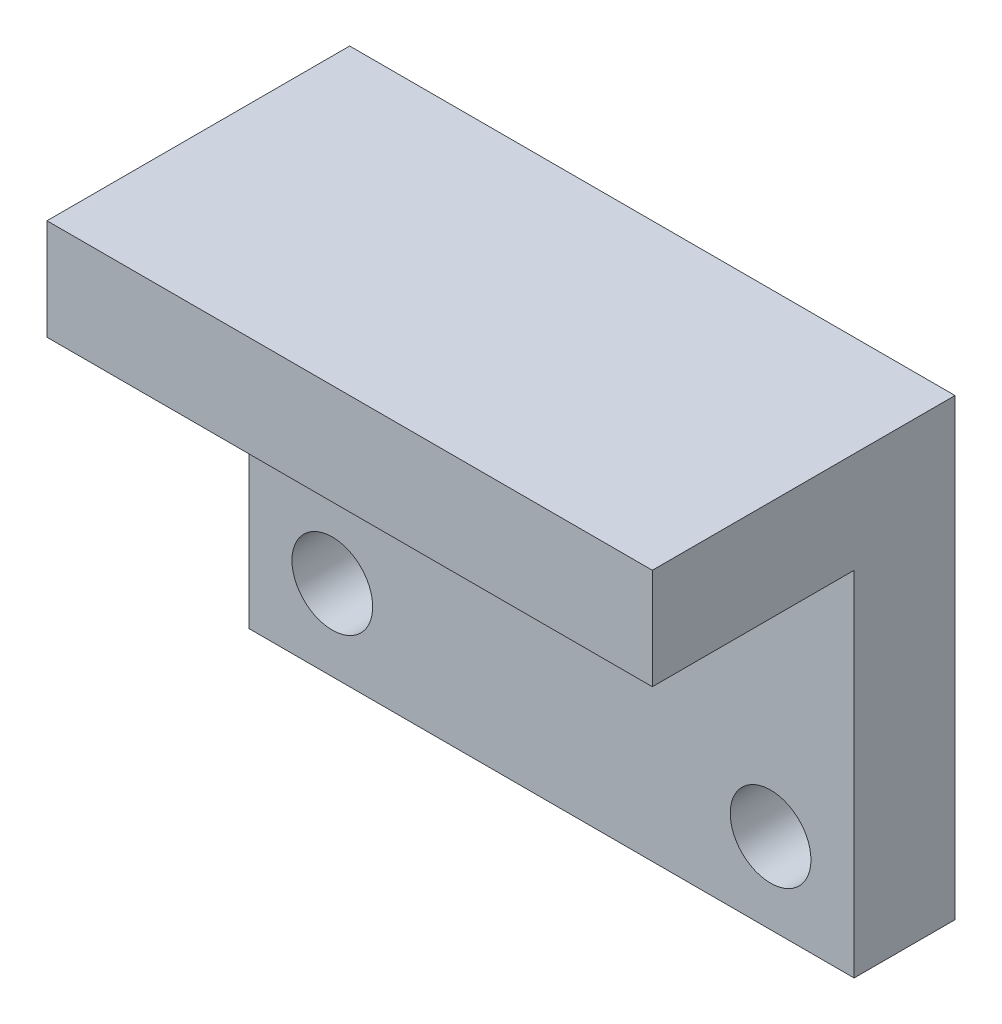
ISO-10303-21;
HEADER;
FILE_DESCRIPTION(('STEP AP214'),'2;1');
FILE_NAME('part.step','',(''),(''),'','','');
FILE_SCHEMA(('AUTOMOTIVE_DESIGN { 1 0 10303 214 1 1 1 1 }'));
ENDSEC;
DATA;
#1=APPLICATION_CONTEXT('core data for automotive mechanical design processes');
#2=APPLICATION_PROTOCOL_DEFINITION('international standard','automotive_design',2000,#1);
#3=PRODUCT_CONTEXT('',#1,'mechanical');
#4=PRODUCT('Part','Part','',(#3));
#5=PRODUCT_RELATED_PRODUCT_CATEGORY('part','',(#4));
#6=PRODUCT_DEFINITION_FORMATION('','',#4);
#7=PRODUCT_DEFINITION_CONTEXT('part definition',#1,'design');
#8=PRODUCT_DEFINITION('design','',#6,#7);
#9=PRODUCT_DEFINITION_SHAPE('','',#8);
#10=(LENGTH_UNIT() NAMED_UNIT(*) SI_UNIT(.MILLI.,.METRE.));
#11=(NAMED_UNIT(*) PLANE_ANGLE_UNIT() SI_UNIT($,.RADIAN.));
#12=(NAMED_UNIT(*) SI_UNIT($,.STERADIAN.) SOLID_ANGLE_UNIT());
#13=UNCERTAINTY_MEASURE_WITH_UNIT(LENGTH_MEASURE(1.E-05),#10,'distance_accuracy_value','');
#14=(GEOMETRIC_REPRESENTATION_CONTEXT(3) GLOBAL_UNCERTAINTY_ASSIGNED_CONTEXT((#13)) GLOBAL_UNIT_ASSIGNED_CONTEXT((#10,
#11,#12)) REPRESENTATION_CONTEXT('',''));
#15=CARTESIAN_POINT('',(0.,0.,0.));
#16=DIRECTION('',(0.,0.,1.));
#17=DIRECTION('',(1.,0.,0.));
#18=AXIS2_PLACEMENT_3D('',#15,#16,#17);
#19=CARTESIAN_POINT('',(0.,0.,5.));
#20=DIRECTION('',(0.,0.,1.));
#21=DIRECTION('',(1.,0.,0.));
#22=AXIS2_PLACEMENT_3D('',#19,#20,#21);
#23=PLANE('',#22);
#24=CARTESIAN_POINT('',(10.86,-3.5,5.));
#25=DIRECTION('',(0.,0.,1.));
#26=DIRECTION('',(1.,0.,0.));
#27=AXIS2_PLACEMENT_3D('',#24,#25,#26);
#28=CIRCLE('',#27,2.);
#29=CARTESIAN_POINT('',(12.86,-3.5,5.));
#30=VERTEX_POINT('',#29);
#31=EDGE_CURVE('E115',#30,#30,#28,.T.);
#32=ORIENTED_EDGE('',*,*,#31,.F.);
#33=EDGE_LOOP('',(#32));
#34=FACE_BOUND('',#33,.T.);
#35=DIRECTION('',(0.,1.,0.));
#36=VECTOR('',#35,1.);
#37=CARTESIAN_POINT('',(15.,10.,5.));
#38=LINE('',#37,#36);
#39=CARTESIAN_POINT('',(15.,-7.5,5.));
#40=VERTEX_POINT('',#39);
#41=CARTESIAN_POINT('',(15.,10.,5.));
#42=VERTEX_POINT('',#41);
#43=EDGE_CURVE('E101',#40,#42,#38,.T.);
#44=ORIENTED_EDGE('',*,*,#43,.T.);
#45=DIRECTION('',(-1.,0.,0.));
#46=VECTOR('',#45,1.);
#47=CARTESIAN_POINT('',(-15.,10.,5.));
#48=LINE('',#47,#46);
#49=CARTESIAN_POINT('',(-15.,10.,5.));
#50=VERTEX_POINT('',#49);
#51=EDGE_CURVE('E78',#42,#50,#48,.T.);
#52=ORIENTED_EDGE('',*,*,#51,.T.);
#53=DIRECTION('',(0.,-1.,0.));
#54=VECTOR('',#53,1.);
#55=CARTESIAN_POINT('',(-15.,10.,5.));
#56=LINE('',#55,#54);
#57=CARTESIAN_POINT('',(-15.,-7.5,5.));
#58=VERTEX_POINT('',#57);
#59=EDGE_CURVE('E99',#50,#58,#56,.T.);
#60=ORIENTED_EDGE('',*,*,#59,.T.);
#61=DIRECTION('',(1.,0.,0.));
#62=VECTOR('',#61,1.);
#63=CARTESIAN_POINT('',(-15.,-7.5,5.));
#64=LINE('',#63,#62);
#65=EDGE_CURVE('E57',#58,#40,#64,.T.);
#66=ORIENTED_EDGE('',*,*,#65,.T.);
#67=EDGE_LOOP('',(#44,#52,#60,#66));
#68=FACE_BOUND('',#67,.T.);
#69=CARTESIAN_POINT('',(-10.86,-3.5,5.));
#70=DIRECTION('',(0.,0.,1.));
#71=DIRECTION('',(-1.,0.,0.));
#72=AXIS2_PLACEMENT_3D('',#69,#70,#71);
#73=CIRCLE('',#72,2.);
#74=CARTESIAN_POINT('',(-12.86,-3.5,5.));
#75=VERTEX_POINT('',#74);
#76=EDGE_CURVE('E154',#75,#75,#73,.T.);
#77=ORIENTED_EDGE('',*,*,#76,.F.);
#78=EDGE_LOOP('',(#77));
#79=FACE_BOUND('',#78,.T.);
#80=ADVANCED_FACE('F39',(#34,#68,#79),#23,.T.);
#81=CARTESIAN_POINT('',(0.,0.,0.));
#82=DIRECTION('',(0.,0.,1.));
#83=DIRECTION('',(1.,0.,0.));
#84=AXIS2_PLACEMENT_3D('',#81,#82,#83);
#85=PLANE('',#84);
#86=DIRECTION('',(0.,1.,0.));
#87=VECTOR('',#86,1.);
#88=CARTESIAN_POINT('',(15.,10.,0.));
#89=LINE('',#88,#87);
#90=CARTESIAN_POINT('',(15.,-7.5,0.));
#91=VERTEX_POINT('',#90);
#92=CARTESIAN_POINT('',(15.,15.,0.));
#93=VERTEX_POINT('',#92);
#94=EDGE_CURVE('E111',#91,#93,#89,.T.);
#95=ORIENTED_EDGE('',*,*,#94,.F.);
#96=DIRECTION('',(1.,0.,0.));
#97=VECTOR('',#96,1.);
#98=CARTESIAN_POINT('',(-15.,-7.5,0.));
#99=LINE('',#98,#97);
#100=CARTESIAN_POINT('',(-15.,-7.5,0.));
#101=VERTEX_POINT('',#100);
#102=EDGE_CURVE('E118',#101,#91,#99,.T.);
#103=ORIENTED_EDGE('',*,*,#102,.F.);
#104=DIRECTION('',(0.,-1.,0.));
#105=VECTOR('',#104,1.);
#106=CARTESIAN_POINT('',(-15.,10.,0.));
#107=LINE('',#106,#105);
#108=CARTESIAN_POINT('',(-15.,15.,0.));
#109=VERTEX_POINT('',#108);
#110=EDGE_CURVE('E69',#109,#101,#107,.T.);
#111=ORIENTED_EDGE('',*,*,#110,.F.);
#112=DIRECTION('',(-1.,0.,0.));
#113=VECTOR('',#112,1.);
#114=CARTESIAN_POINT('',(-15.,15.,0.));
#115=LINE('',#114,#113);
#116=EDGE_CURVE('E134',#93,#109,#115,.T.);
#117=ORIENTED_EDGE('',*,*,#116,.F.);
#118=EDGE_LOOP('',(#95,#103,#111,#117));
#119=FACE_BOUND('',#118,.T.);
#120=CARTESIAN_POINT('',(10.86,-3.5,0.));
#121=DIRECTION('',(0.,0.,1.));
#122=DIRECTION('',(1.,0.,0.));
#123=AXIS2_PLACEMENT_3D('',#120,#121,#122);
#124=CIRCLE('',#123,2.);
#125=CARTESIAN_POINT('',(12.86,-3.5,0.));
#126=VERTEX_POINT('',#125);
#127=EDGE_CURVE('E158',#126,#126,#124,.T.);
#128=ORIENTED_EDGE('',*,*,#127,.T.);
#129=EDGE_LOOP('',(#128));
#130=FACE_BOUND('',#129,.T.);
#131=CARTESIAN_POINT('',(-10.86,-3.5,0.));
#132=DIRECTION('',(0.,0.,1.));
#133=DIRECTION('',(-1.,0.,0.));
#134=AXIS2_PLACEMENT_3D('',#131,#132,#133);
#135=CIRCLE('',#134,2.);
#136=CARTESIAN_POINT('',(-12.86,-3.5,0.));
#137=VERTEX_POINT('',#136);
#138=EDGE_CURVE('E153',#137,#137,#135,.T.);
#139=ORIENTED_EDGE('',*,*,#138,.T.);
#140=EDGE_LOOP('',(#139));
#141=FACE_BOUND('',#140,.T.);
#142=ADVANCED_FACE('F131',(#119,#130,#141),#85,.F.);
#143=CARTESIAN_POINT('',(15.,10.,5.));
#144=DIRECTION('',(-1.,0.,0.));
#145=DIRECTION('',(0.,0.,1.));
#146=AXIS2_PLACEMENT_3D('',#143,#144,#145);
#147=PLANE('',#146);
#148=ORIENTED_EDGE('',*,*,#94,.T.);
#149=DIRECTION('',(0.,0.,-1.));
#150=VECTOR('',#149,1.);
#151=CARTESIAN_POINT('',(15.,15.,15.));
#152=LINE('',#151,#150);
#153=CARTESIAN_POINT('',(15.,15.,15.));
#154=VERTEX_POINT('',#153);
#155=EDGE_CURVE('E147',#154,#93,#152,.T.);
#156=ORIENTED_EDGE('',*,*,#155,.F.);
#157=DIRECTION('',(0.,1.,0.));
#158=VECTOR('',#157,1.);
#159=CARTESIAN_POINT('',(15.,10.,15.));
#160=LINE('',#159,#158);
#161=CARTESIAN_POINT('',(15.,10.,15.));
#162=VERTEX_POINT('',#161);
#163=EDGE_CURVE('E140',#162,#154,#160,.T.);
#164=ORIENTED_EDGE('',*,*,#163,.F.);
#165=DIRECTION('',(0.,0.,-1.));
#166=VECTOR('',#165,1.);
#167=CARTESIAN_POINT('',(15.,10.,15.));
#168=LINE('',#167,#166);
#169=EDGE_CURVE('E150',#162,#42,#168,.T.);
#170=ORIENTED_EDGE('',*,*,#169,.T.);
#171=ORIENTED_EDGE('',*,*,#43,.F.);
#172=DIRECTION('',(0.,0.,-1.));
#173=VECTOR('',#172,1.);
#174=CARTESIAN_POINT('',(15.,-7.5,5.));
#175=LINE('',#174,#173);
#176=EDGE_CURVE('E49',#40,#91,#175,.T.);
#177=ORIENTED_EDGE('',*,*,#176,.T.);
#178=EDGE_LOOP('',(#148,#156,#164,#170,#171,#177));
#179=FACE_BOUND('',#178,.T.);
#180=ADVANCED_FACE('F41',(#179),#147,.F.);
#181=CARTESIAN_POINT('',(-15.,10.,5.));
#182=DIRECTION('',(1.,0.,0.));
#183=DIRECTION('',(0.,1.,0.));
#184=AXIS2_PLACEMENT_3D('',#181,#182,#183);
#185=PLANE('',#184);
#186=ORIENTED_EDGE('',*,*,#110,.T.);
#187=DIRECTION('',(0.,0.,-1.));
#188=VECTOR('',#187,1.);
#189=CARTESIAN_POINT('',(-15.,-7.5,5.));
#190=LINE('',#189,#188);
#191=EDGE_CURVE('E11',#58,#101,#190,.T.);
#192=ORIENTED_EDGE('',*,*,#191,.F.);
#193=ORIENTED_EDGE('',*,*,#59,.F.);
#194=DIRECTION('',(0.,0.,-1.));
#195=VECTOR('',#194,1.);
#196=CARTESIAN_POINT('',(-15.,10.,15.));
#197=LINE('',#196,#195);
#198=CARTESIAN_POINT('',(-15.,10.,15.));
#199=VERTEX_POINT('',#198);
#200=EDGE_CURVE('E88',#199,#50,#197,.T.);
#201=ORIENTED_EDGE('',*,*,#200,.F.);
#202=DIRECTION('',(0.,-1.,0.));
#203=VECTOR('',#202,1.);
#204=CARTESIAN_POINT('',(-15.,10.,15.));
#205=LINE('',#204,#203);
#206=CARTESIAN_POINT('',(-15.,15.,15.));
#207=VERTEX_POINT('',#206);
#208=EDGE_CURVE('E96',#207,#199,#205,.T.);
#209=ORIENTED_EDGE('',*,*,#208,.F.);
#210=DIRECTION('',(0.,0.,-1.));
#211=VECTOR('',#210,1.);
#212=CARTESIAN_POINT('',(-15.,15.,15.));
#213=LINE('',#212,#211);
#214=EDGE_CURVE('E95',#207,#109,#213,.T.);
#215=ORIENTED_EDGE('',*,*,#214,.T.);
#216=EDGE_LOOP('',(#186,#192,#193,#201,#209,#215));
#217=FACE_BOUND('',#216,.T.);
#218=ADVANCED_FACE('F104',(#217),#185,.F.);
#219=CARTESIAN_POINT('',(-15.,-7.5,5.));
#220=DIRECTION('',(0.,1.,0.));
#221=DIRECTION('',(0.,0.,1.));
#222=AXIS2_PLACEMENT_3D('',#219,#220,#221);
#223=PLANE('',#222);
#224=ORIENTED_EDGE('',*,*,#102,.T.);
#225=ORIENTED_EDGE('',*,*,#176,.F.);
#226=ORIENTED_EDGE('',*,*,#65,.F.);
#227=ORIENTED_EDGE('',*,*,#191,.T.);
#228=EDGE_LOOP('',(#224,#225,#226,#227));
#229=FACE_BOUND('',#228,.T.);
#230=ADVANCED_FACE('F206',(#229),#223,.F.);
#231=CARTESIAN_POINT('',(10.86,-3.5,5.));
#232=DIRECTION('',(0.,0.,-1.));
#233=DIRECTION('',(-1.,0.,0.));
#234=AXIS2_PLACEMENT_3D('',#231,#232,#233);
#235=CYLINDRICAL_SURFACE('',#234,2.);
#236=ORIENTED_EDGE('',*,*,#31,.T.);
#237=EDGE_LOOP('',(#236));
#238=FACE_BOUND('',#237,.T.);
#239=ORIENTED_EDGE('',*,*,#127,.F.);
#240=EDGE_LOOP('',(#239));
#241=FACE_BOUND('',#240,.T.);
#242=ADVANCED_FACE('F203',(#238,#241),#235,.F.);
#243=CARTESIAN_POINT('',(-10.86,-3.5,5.));
#244=DIRECTION('',(0.,0.,-1.));
#245=DIRECTION('',(-1.,0.,0.));
#246=AXIS2_PLACEMENT_3D('',#243,#244,#245);
#247=CYLINDRICAL_SURFACE('',#246,2.);
#248=ORIENTED_EDGE('',*,*,#76,.T.);
#249=EDGE_LOOP('',(#248));
#250=FACE_BOUND('',#249,.T.);
#251=ORIENTED_EDGE('',*,*,#138,.F.);
#252=EDGE_LOOP('',(#251));
#253=FACE_BOUND('',#252,.T.);
#254=ADVANCED_FACE('F192',(#250,#253),#247,.F.);
#255=CARTESIAN_POINT('',(15.,10.,15.));
#256=DIRECTION('',(0.,1.,0.));
#257=DIRECTION('',(0.,0.,1.));
#258=AXIS2_PLACEMENT_3D('',#255,#256,#257);
#259=PLANE('',#258);
#260=ORIENTED_EDGE('',*,*,#51,.F.);
#261=ORIENTED_EDGE('',*,*,#169,.F.);
#262=DIRECTION('',(1.,0.,0.));
#263=VECTOR('',#262,1.);
#264=CARTESIAN_POINT('',(15.,10.,15.));
#265=LINE('',#264,#263);
#266=EDGE_CURVE('E91',#199,#162,#265,.T.);
#267=ORIENTED_EDGE('',*,*,#266,.F.);
#268=ORIENTED_EDGE('',*,*,#200,.T.);
#269=EDGE_LOOP('',(#260,#261,#267,#268));
#270=FACE_BOUND('',#269,.T.);
#271=ADVANCED_FACE('F89',(#270),#259,.F.);
#272=CARTESIAN_POINT('',(-15.,15.,15.));
#273=DIRECTION('',(0.,-1.,0.));
#274=DIRECTION('',(0.,0.,-1.));
#275=AXIS2_PLACEMENT_3D('',#272,#273,#274);
#276=PLANE('',#275);
#277=ORIENTED_EDGE('',*,*,#116,.T.);
#278=ORIENTED_EDGE('',*,*,#214,.F.);
#279=DIRECTION('',(-1.,0.,0.));
#280=VECTOR('',#279,1.);
#281=CARTESIAN_POINT('',(-15.,15.,15.));
#282=LINE('',#281,#280);
#283=EDGE_CURVE('E170',#154,#207,#282,.T.);
#284=ORIENTED_EDGE('',*,*,#283,.F.);
#285=ORIENTED_EDGE('',*,*,#155,.T.);
#286=EDGE_LOOP('',(#277,#278,#284,#285));
#287=FACE_BOUND('',#286,.T.);
#288=ADVANCED_FACE('F182',(#287),#276,.F.);
#289=CARTESIAN_POINT('',(0.,0.,15.));
#290=DIRECTION('',(0.,0.,-1.));
#291=DIRECTION('',(-1.,0.,0.));
#292=AXIS2_PLACEMENT_3D('',#289,#290,#291);
#293=PLANE('',#292);
#294=ORIENTED_EDGE('',*,*,#266,.T.);
#295=ORIENTED_EDGE('',*,*,#163,.T.);
#296=ORIENTED_EDGE('',*,*,#283,.T.);
#297=ORIENTED_EDGE('',*,*,#208,.T.);
#298=EDGE_LOOP('',(#294,#295,#296,#297));
#299=FACE_BOUND('',#298,.T.);
#300=ADVANCED_FACE('F178',(#299),#293,.F.);
#301=CLOSED_SHELL('',(#80,#142,#180,#218,#230,#242,#254,#271,#288,#300));
#302=MANIFOLD_SOLID_BREP('B2',#301);
#303=ADVANCED_BREP_SHAPE_REPRESENTATION('',(#18,#302),#14);
#304=SHAPE_DEFINITION_REPRESENTATION(#9,#303);
ENDSEC;
END-ISO-10303-21;
